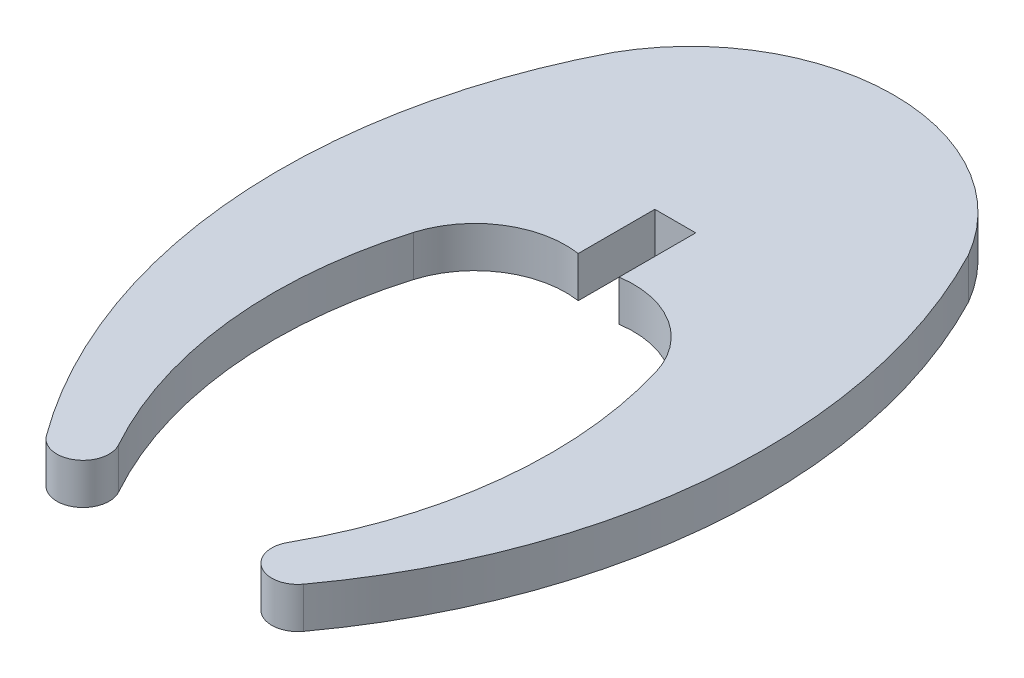
ISO-10303-21;
HEADER;
FILE_DESCRIPTION(('STEP AP214'),'2;1');
FILE_NAME('part.step','',(''),(''),'','','');
FILE_SCHEMA(('AUTOMOTIVE_DESIGN { 1 0 10303 214 1 1 1 1 }'));
ENDSEC;
DATA;
#1=APPLICATION_CONTEXT('core data for automotive mechanical design processes');
#2=APPLICATION_PROTOCOL_DEFINITION('international standard','automotive_design',2000,#1);
#3=PRODUCT_CONTEXT('',#1,'mechanical');
#4=PRODUCT('Part','Part','',(#3));
#5=PRODUCT_RELATED_PRODUCT_CATEGORY('part','',(#4));
#6=PRODUCT_DEFINITION_FORMATION('','',#4);
#7=PRODUCT_DEFINITION_CONTEXT('part definition',#1,'design');
#8=PRODUCT_DEFINITION('design','',#6,#7);
#9=PRODUCT_DEFINITION_SHAPE('','',#8);
#10=(LENGTH_UNIT() NAMED_UNIT(*) SI_UNIT(.MILLI.,.METRE.));
#11=(NAMED_UNIT(*) PLANE_ANGLE_UNIT() SI_UNIT($,.RADIAN.));
#12=(NAMED_UNIT(*) SI_UNIT($,.STERADIAN.) SOLID_ANGLE_UNIT());
#13=UNCERTAINTY_MEASURE_WITH_UNIT(LENGTH_MEASURE(1.E-05),#10,'distance_accuracy_value','');
#14=(GEOMETRIC_REPRESENTATION_CONTEXT(3) GLOBAL_UNCERTAINTY_ASSIGNED_CONTEXT((#13)) GLOBAL_UNIT_ASSIGNED_CONTEXT((#10,
#11,#12)) REPRESENTATION_CONTEXT('',''));
#15=CARTESIAN_POINT('',(0.,0.,0.));
#16=DIRECTION('',(0.,0.,1.));
#17=DIRECTION('',(1.,0.,0.));
#18=AXIS2_PLACEMENT_3D('',#15,#16,#17);
#19=CARTESIAN_POINT('',(-42020.7050947911,3.,-18314.3835108884));
#20=DIRECTION('',(0.,-1.,0.));
#21=DIRECTION('',(0.,0.,-1.));
#22=AXIS2_PLACEMENT_3D('',#19,#20,#21);
#23=CYLINDRICAL_SURFACE('',#22,6.67415036290321);
#24=CARTESIAN_POINT('',(-42020.7050947911,0.,-18314.3835108884));
#25=DIRECTION('',(0.,-1.,0.));
#26=DIRECTION('',(0.,0.,1.));
#27=AXIS2_PLACEMENT_3D('',#24,#25,#26);
#28=CIRCLE('',#27,6.67415036290321);
#29=CARTESIAN_POINT('',(-42027.104185,0.,-18316.279804));
#30=VERTEX_POINT('',#29);
#31=CARTESIAN_POINT('',(-42019.71875,0.,-18320.984375));
#32=VERTEX_POINT('',#31);
#33=EDGE_CURVE('E155',#30,#32,#28,.T.);
#34=ORIENTED_EDGE('',*,*,#33,.T.);
#35=DIRECTION('',(0.,-1.,0.));
#36=VECTOR('',#35,1.);
#37=CARTESIAN_POINT('',(-42019.71875,3.,-18320.984375));
#38=LINE('',#37,#36);
#39=CARTESIAN_POINT('',(-42019.71875,3.,-18320.984375));
#40=VERTEX_POINT('',#39);
#41=EDGE_CURVE('E11',#40,#32,#38,.T.);
#42=ORIENTED_EDGE('',*,*,#41,.F.);
#43=CARTESIAN_POINT('',(-42020.7050947911,3.,-18314.3835108884));
#44=DIRECTION('',(0.,-1.,0.));
#45=DIRECTION('',(0.,0.,1.));
#46=AXIS2_PLACEMENT_3D('',#43,#44,#45);
#47=CIRCLE('',#46,6.67415036290321);
#48=CARTESIAN_POINT('',(-42027.104185,3.,-18316.279804));
#49=VERTEX_POINT('',#48);
#50=EDGE_CURVE('E177',#49,#40,#47,.T.);
#51=ORIENTED_EDGE('',*,*,#50,.F.);
#52=DIRECTION('',(0.,-1.,0.));
#53=VECTOR('',#52,1.);
#54=CARTESIAN_POINT('',(-42027.104185,3.,-18316.279804));
#55=LINE('',#54,#53);
#56=EDGE_CURVE('E151',#49,#30,#55,.T.);
#57=ORIENTED_EDGE('',*,*,#56,.T.);
#58=EDGE_LOOP('',(#34,#42,#51,#57));
#59=FACE_BOUND('',#58,.T.);
#60=ADVANCED_FACE('F35',(#59),#23,.F.);
#61=CARTESIAN_POINT('',(-42019.71875,3.,-18320.984375));
#62=DIRECTION('',(-1.,0.,0.));
#63=DIRECTION('',(0.,0.,1.));
#64=AXIS2_PLACEMENT_3D('',#61,#62,#63);
#65=PLANE('',#64);
#66=DIRECTION('',(0.,0.,-1.));
#67=VECTOR('',#66,1.);
#68=CARTESIAN_POINT('',(-42019.71875,0.,-18320.984375));
#69=LINE('',#68,#67);
#70=CARTESIAN_POINT('',(-42019.71875,0.,-18326.601562));
#71=VERTEX_POINT('',#70);
#72=EDGE_CURVE('E158',#32,#71,#69,.T.);
#73=ORIENTED_EDGE('',*,*,#72,.T.);
#74=DIRECTION('',(0.,-1.,0.));
#75=VECTOR('',#74,1.);
#76=CARTESIAN_POINT('',(-42019.71875,3.,-18326.601562));
#77=LINE('',#76,#75);
#78=CARTESIAN_POINT('',(-42019.71875,3.,-18326.601562));
#79=VERTEX_POINT('',#78);
#80=EDGE_CURVE('E43',#79,#71,#77,.T.);
#81=ORIENTED_EDGE('',*,*,#80,.F.);
#82=DIRECTION('',(0.,0.,-1.));
#83=VECTOR('',#82,1.);
#84=CARTESIAN_POINT('',(-42019.71875,3.,-18320.984375));
#85=LINE('',#84,#83);
#86=EDGE_CURVE('E106',#40,#79,#85,.T.);
#87=ORIENTED_EDGE('',*,*,#86,.F.);
#88=ORIENTED_EDGE('',*,*,#41,.T.);
#89=EDGE_LOOP('',(#73,#81,#87,#88));
#90=FACE_BOUND('',#89,.T.);
#91=ADVANCED_FACE('F255',(#90),#65,.F.);
#92=CARTESIAN_POINT('',(-42019.71875,3.,-18326.601562));
#93=DIRECTION('',(0.,0.,-1.));
#94=DIRECTION('',(-1.,0.,0.));
#95=AXIS2_PLACEMENT_3D('',#92,#93,#94);
#96=PLANE('',#95);
#97=DIRECTION('',(1.,0.,0.));
#98=VECTOR('',#97,1.);
#99=CARTESIAN_POINT('',(-42019.71875,0.,-18326.601562));
#100=LINE('',#99,#98);
#101=CARTESIAN_POINT('',(-42016.722656,0.,-18326.601562));
#102=VERTEX_POINT('',#101);
#103=EDGE_CURVE('E160',#71,#102,#100,.T.);
#104=ORIENTED_EDGE('',*,*,#103,.T.);
#105=DIRECTION('',(0.,-1.,0.));
#106=VECTOR('',#105,1.);
#107=CARTESIAN_POINT('',(-42016.722656,3.,-18326.601562));
#108=LINE('',#107,#106);
#109=CARTESIAN_POINT('',(-42016.722656,3.,-18326.601562));
#110=VERTEX_POINT('',#109);
#111=EDGE_CURVE('E196',#110,#102,#108,.T.);
#112=ORIENTED_EDGE('',*,*,#111,.F.);
#113=DIRECTION('',(1.,0.,0.));
#114=VECTOR('',#113,1.);
#115=CARTESIAN_POINT('',(-42019.71875,3.,-18326.601562));
#116=LINE('',#115,#114);
#117=EDGE_CURVE('E204',#79,#110,#116,.T.);
#118=ORIENTED_EDGE('',*,*,#117,.F.);
#119=ORIENTED_EDGE('',*,*,#80,.T.);
#120=EDGE_LOOP('',(#104,#112,#118,#119));
#121=FACE_BOUND('',#120,.T.);
#122=ADVANCED_FACE('F202',(#121),#96,.F.);
#123=CARTESIAN_POINT('',(-42016.722656,3.,-18326.601562));
#124=DIRECTION('',(1.,0.,-6.32692008702308E-12));
#125=DIRECTION('',(-6.32692008702308E-12,0.,-1.));
#126=AXIS2_PLACEMENT_3D('',#123,#124,#125);
#127=PLANE('',#126);
#128=DIRECTION('',(6.32692008702308E-12,0.,1.));
#129=VECTOR('',#128,1.);
#130=CARTESIAN_POINT('',(-42016.722656,0.,-18326.601562));
#131=LINE('',#130,#129);
#132=CARTESIAN_POINT('',(-42016.722656,0.,-18320.986328));
#133=VERTEX_POINT('',#132);
#134=EDGE_CURVE('E162',#102,#133,#131,.T.);
#135=ORIENTED_EDGE('',*,*,#134,.T.);
#136=DIRECTION('',(0.,-1.,0.));
#137=VECTOR('',#136,1.);
#138=CARTESIAN_POINT('',(-42016.722656,3.,-18320.986328));
#139=LINE('',#138,#137);
#140=CARTESIAN_POINT('',(-42016.722656,3.,-18320.986328));
#141=VERTEX_POINT('',#140);
#142=EDGE_CURVE('E193',#141,#133,#139,.T.);
#143=ORIENTED_EDGE('',*,*,#142,.F.);
#144=DIRECTION('',(6.32692008702308E-12,0.,1.));
#145=VECTOR('',#144,1.);
#146=CARTESIAN_POINT('',(-42016.722656,3.,-18326.601562));
#147=LINE('',#146,#145);
#148=EDGE_CURVE('E222',#110,#141,#147,.T.);
#149=ORIENTED_EDGE('',*,*,#148,.F.);
#150=ORIENTED_EDGE('',*,*,#111,.T.);
#151=EDGE_LOOP('',(#135,#143,#149,#150));
#152=FACE_BOUND('',#151,.T.);
#153=ADVANCED_FACE('F213',(#152),#127,.F.);
#154=CARTESIAN_POINT('',(-42015.7380765068,3.,-18314.3865887005));
#155=DIRECTION('',(0.,-1.,0.));
#156=DIRECTION('',(0.,0.,-1.));
#157=AXIS2_PLACEMENT_3D('',#154,#155,#156);
#158=CYLINDRICAL_SURFACE('',#157,6.67277720290093);
#159=CARTESIAN_POINT('',(-42015.7380765068,0.,-18314.3865887005));
#160=DIRECTION('',(0.,-1.,0.));
#161=DIRECTION('',(0.,0.,1.));
#162=AXIS2_PLACEMENT_3D('',#159,#160,#161);
#163=CIRCLE('',#162,6.67277720290093);
#164=CARTESIAN_POINT('',(-42009.340276,0.,-18316.282401));
#165=VERTEX_POINT('',#164);
#166=EDGE_CURVE('E164',#133,#165,#163,.T.);
#167=ORIENTED_EDGE('',*,*,#166,.T.);
#168=DIRECTION('',(0.,-1.,0.));
#169=VECTOR('',#168,1.);
#170=CARTESIAN_POINT('',(-42009.340276,3.,-18316.282401));
#171=LINE('',#170,#169);
#172=CARTESIAN_POINT('',(-42009.340276,3.,-18316.282401));
#173=VERTEX_POINT('',#172);
#174=EDGE_CURVE('E190',#173,#165,#171,.T.);
#175=ORIENTED_EDGE('',*,*,#174,.F.);
#176=CARTESIAN_POINT('',(-42015.7380765068,3.,-18314.3865887005));
#177=DIRECTION('',(0.,-1.,0.));
#178=DIRECTION('',(0.,0.,1.));
#179=AXIS2_PLACEMENT_3D('',#176,#177,#178);
#180=CIRCLE('',#179,6.67277720290093);
#181=EDGE_CURVE('E219',#141,#173,#180,.T.);
#182=ORIENTED_EDGE('',*,*,#181,.F.);
#183=ORIENTED_EDGE('',*,*,#142,.T.);
#184=EDGE_LOOP('',(#167,#175,#182,#183));
#185=FACE_BOUND('',#184,.T.);
#186=ADVANCED_FACE('F217',(#185),#158,.F.);
#187=CARTESIAN_POINT('',(-42039.5901535017,3.,-18307.3175005346));
#188=DIRECTION('',(0.,-1.,0.));
#189=DIRECTION('',(0.,0.,-1.));
#190=AXIS2_PLACEMENT_3D('',#187,#188,#189);
#191=CYLINDRICAL_SURFACE('',#190,31.5503491141021);
#192=CARTESIAN_POINT('',(-42039.5901535017,0.,-18307.3175005346));
#193=DIRECTION('',(0.,-1.,0.));
#194=DIRECTION('',(0.,0.,1.));
#195=AXIS2_PLACEMENT_3D('',#192,#193,#194);
#196=CIRCLE('',#195,31.5503491141021);
#197=CARTESIAN_POINT('',(-42012.014861,0.,-18291.9868850001));
#198=VERTEX_POINT('',#197);
#199=EDGE_CURVE('E166',#165,#198,#196,.T.);
#200=ORIENTED_EDGE('',*,*,#199,.T.);
#201=DIRECTION('',(0.,-1.,0.));
#202=VECTOR('',#201,1.);
#203=CARTESIAN_POINT('',(-42012.014861,3.,-18291.9868850001));
#204=LINE('',#203,#202);
#205=CARTESIAN_POINT('',(-42012.014861,3.,-18291.9868850001));
#206=VERTEX_POINT('',#205);
#207=EDGE_CURVE('E187',#206,#198,#204,.T.);
#208=ORIENTED_EDGE('',*,*,#207,.F.);
#209=CARTESIAN_POINT('',(-42039.5901535017,3.,-18307.3175005346));
#210=DIRECTION('',(0.,-1.,0.));
#211=DIRECTION('',(0.,0.,1.));
#212=AXIS2_PLACEMENT_3D('',#209,#210,#211);
#213=CIRCLE('',#212,31.5503491141021);
#214=EDGE_CURVE('E221',#173,#206,#213,.T.);
#215=ORIENTED_EDGE('',*,*,#214,.F.);
#216=ORIENTED_EDGE('',*,*,#174,.T.);
#217=EDGE_LOOP('',(#200,#208,#215,#216));
#218=FACE_BOUND('',#217,.T.);
#219=ADVANCED_FACE('F268',(#218),#191,.F.);
#220=CARTESIAN_POINT('',(-42010.3400105149,3.,-18291.050888032));
#221=DIRECTION('',(0.,-1.,0.));
#222=DIRECTION('',(0.,0.,-1.));
#223=AXIS2_PLACEMENT_3D('',#220,#221,#222);
#224=CYLINDRICAL_SURFACE('',#223,1.91864912680044);
#225=CARTESIAN_POINT('',(-42010.3400105149,0.,-18291.050888032));
#226=DIRECTION('',(0.,1.,0.));
#227=DIRECTION('',(0.,0.,1.));
#228=AXIS2_PLACEMENT_3D('',#225,#226,#227);
#229=CIRCLE('',#228,1.91864912680044);
#230=CARTESIAN_POINT('',(-42008.793025,0.,-18289.915965));
#231=VERTEX_POINT('',#230);
#232=EDGE_CURVE('E168',#198,#231,#229,.T.);
#233=ORIENTED_EDGE('',*,*,#232,.T.);
#234=DIRECTION('',(0.,-1.,0.));
#235=VECTOR('',#234,1.);
#236=CARTESIAN_POINT('',(-42008.793025,3.,-18289.915965));
#237=LINE('',#236,#235);
#238=CARTESIAN_POINT('',(-42008.793025,3.,-18289.915965));
#239=VERTEX_POINT('',#238);
#240=EDGE_CURVE('E184',#239,#231,#237,.T.);
#241=ORIENTED_EDGE('',*,*,#240,.F.);
#242=CARTESIAN_POINT('',(-42010.3400105149,3.,-18291.050888032));
#243=DIRECTION('',(0.,1.,0.));
#244=DIRECTION('',(0.,0.,1.));
#245=AXIS2_PLACEMENT_3D('',#242,#243,#244);
#246=CIRCLE('',#245,1.91864912680044);
#247=EDGE_CURVE('E224',#206,#239,#246,.T.);
#248=ORIENTED_EDGE('',*,*,#247,.F.);
#249=ORIENTED_EDGE('',*,*,#207,.T.);
#250=EDGE_LOOP('',(#233,#241,#248,#249));
#251=FACE_BOUND('',#250,.T.);
#252=ADVANCED_FACE('F271',(#251),#224,.T.);
#253=CARTESIAN_POINT('',(-42043.4335365749,3.,-18315.3464519694));
#254=DIRECTION('',(0.,-1.,0.));
#255=DIRECTION('',(0.,0.,-1.));
#256=AXIS2_PLACEMENT_3D('',#253,#254,#255);
#257=CYLINDRICAL_SURFACE('',#256,42.9729532342011);
#258=CARTESIAN_POINT('',(-42043.4335365749,0.,-18315.3464519694));
#259=DIRECTION('',(0.,1.,0.));
#260=DIRECTION('',(0.,0.,1.));
#261=AXIS2_PLACEMENT_3D('',#258,#259,#260);
#262=CIRCLE('',#261,42.9729532342011);
#263=CARTESIAN_POINT('',(-42005.321092,0.,-18335.198814));
#264=VERTEX_POINT('',#263);
#265=EDGE_CURVE('E170',#231,#264,#262,.T.);
#266=ORIENTED_EDGE('',*,*,#265,.T.);
#267=DIRECTION('',(0.,-1.,0.));
#268=VECTOR('',#267,1.);
#269=CARTESIAN_POINT('',(-42005.321092,3.,-18335.198814));
#270=LINE('',#269,#268);
#271=CARTESIAN_POINT('',(-42005.321092,3.,-18335.198814));
#272=VERTEX_POINT('',#271);
#273=EDGE_CURVE('E181',#272,#264,#270,.T.);
#274=ORIENTED_EDGE('',*,*,#273,.F.);
#275=CARTESIAN_POINT('',(-42043.4335365749,3.,-18315.3464519694));
#276=DIRECTION('',(0.,1.,0.));
#277=DIRECTION('',(0.,0.,1.));
#278=AXIS2_PLACEMENT_3D('',#275,#276,#277);
#279=CIRCLE('',#278,42.9729532342011);
#280=EDGE_CURVE('E230',#239,#272,#279,.T.);
#281=ORIENTED_EDGE('',*,*,#280,.F.);
#282=ORIENTED_EDGE('',*,*,#240,.T.);
#283=EDGE_LOOP('',(#266,#274,#281,#282));
#284=FACE_BOUND('',#283,.T.);
#285=ADVANCED_FACE('F236',(#284),#257,.T.);
#286=CARTESIAN_POINT('',(-42018.2174311932,3.,-18327.7070382815));
#287=DIRECTION('',(0.,-1.,0.));
#288=DIRECTION('',(0.,0.,-1.));
#289=AXIS2_PLACEMENT_3D('',#286,#287,#288);
#290=CYLINDRICAL_SURFACE('',#289,14.9144985836977);
#291=CARTESIAN_POINT('',(-42018.2174311932,0.,-18327.7070382815));
#292=DIRECTION('',(0.,1.,0.));
#293=DIRECTION('',(0.,0.,1.));
#294=AXIS2_PLACEMENT_3D('',#291,#292,#293);
#295=CIRCLE('',#294,14.9144985836977);
#296=CARTESIAN_POINT('',(-42031.1956930001,0.,-18335.055983));
#297=VERTEX_POINT('',#296);
#298=EDGE_CURVE('E172',#264,#297,#295,.T.);
#299=ORIENTED_EDGE('',*,*,#298,.T.);
#300=DIRECTION('',(0.,-1.,0.));
#301=VECTOR('',#300,1.);
#302=CARTESIAN_POINT('',(-42031.1956930001,3.,-18335.055983));
#303=LINE('',#302,#301);
#304=CARTESIAN_POINT('',(-42031.1956930001,3.,-18335.055983));
#305=VERTEX_POINT('',#304);
#306=EDGE_CURVE('E146',#305,#297,#303,.T.);
#307=ORIENTED_EDGE('',*,*,#306,.F.);
#308=CARTESIAN_POINT('',(-42018.2174311932,3.,-18327.7070382815));
#309=DIRECTION('',(0.,1.,0.));
#310=DIRECTION('',(0.,0.,1.));
#311=AXIS2_PLACEMENT_3D('',#308,#309,#310);
#312=CIRCLE('',#311,14.9144985836977);
#313=EDGE_CURVE('E137',#272,#305,#312,.T.);
#314=ORIENTED_EDGE('',*,*,#313,.F.);
#315=ORIENTED_EDGE('',*,*,#273,.T.);
#316=EDGE_LOOP('',(#299,#307,#314,#315));
#317=FACE_BOUND('',#316,.T.);
#318=ADVANCED_FACE('F240',(#317),#290,.T.);
#319=CARTESIAN_POINT('',(-41993.0077657636,3.,-18315.3490206409));
#320=DIRECTION('',(0.,-1.,0.));
#321=DIRECTION('',(0.,0.,-1.));
#322=AXIS2_PLACEMENT_3D('',#319,#320,#321);
#323=CYLINDRICAL_SURFACE('',#322,42.9730398278037);
#324=CARTESIAN_POINT('',(-41993.0077657636,0.,-18315.3490206409));
#325=DIRECTION('',(0.,1.,0.));
#326=DIRECTION('',(0.,0.,1.));
#327=AXIS2_PLACEMENT_3D('',#324,#325,#326);
#328=CIRCLE('',#327,42.9730398278037);
#329=CARTESIAN_POINT('',(-42027.6485700001,0.,-18289.918786));
#330=VERTEX_POINT('',#329);
#331=EDGE_CURVE('E145',#297,#330,#328,.T.);
#332=ORIENTED_EDGE('',*,*,#331,.T.);
#333=DIRECTION('',(0.,-1.,0.));
#334=VECTOR('',#333,1.);
#335=CARTESIAN_POINT('',(-42027.6485700001,3.,-18289.918786));
#336=LINE('',#335,#334);
#337=CARTESIAN_POINT('',(-42027.6485700001,3.,-18289.918786));
#338=VERTEX_POINT('',#337);
#339=EDGE_CURVE('E142',#338,#330,#336,.T.);
#340=ORIENTED_EDGE('',*,*,#339,.F.);
#341=CARTESIAN_POINT('',(-41993.0077657636,3.,-18315.3490206409));
#342=DIRECTION('',(0.,1.,0.));
#343=DIRECTION('',(0.,0.,1.));
#344=AXIS2_PLACEMENT_3D('',#341,#342,#343);
#345=CIRCLE('',#344,42.9730398278037);
#346=EDGE_CURVE('E131',#305,#338,#345,.T.);
#347=ORIENTED_EDGE('',*,*,#346,.F.);
#348=ORIENTED_EDGE('',*,*,#306,.T.);
#349=EDGE_LOOP('',(#332,#340,#347,#348));
#350=FACE_BOUND('',#349,.T.);
#351=ADVANCED_FACE('F143',(#350),#323,.T.);
#352=CARTESIAN_POINT('',(-42026.0988334865,3.,-18291.0519798758));
#353=DIRECTION('',(0.,-1.,0.));
#354=DIRECTION('',(0.,0.,-1.));
#355=AXIS2_PLACEMENT_3D('',#352,#353,#354);
#356=CYLINDRICAL_SURFACE('',#355,1.91984677040394);
#357=CARTESIAN_POINT('',(-42026.0988334865,0.,-18291.0519798758));
#358=DIRECTION('',(0.,1.,0.));
#359=DIRECTION('',(0.,0.,1.));
#360=AXIS2_PLACEMENT_3D('',#357,#358,#359);
#361=CIRCLE('',#360,1.91984677040394);
#362=CARTESIAN_POINT('',(-42024.421329,0.,-18291.985677));
#363=VERTEX_POINT('',#362);
#364=EDGE_CURVE('E92',#330,#363,#361,.T.);
#365=ORIENTED_EDGE('',*,*,#364,.T.);
#366=DIRECTION('',(0.,-1.,0.));
#367=VECTOR('',#366,1.);
#368=CARTESIAN_POINT('',(-42024.421329,3.,-18291.985677));
#369=LINE('',#368,#367);
#370=CARTESIAN_POINT('',(-42024.421329,3.,-18291.985677));
#371=VERTEX_POINT('',#370);
#372=EDGE_CURVE('E147',#371,#363,#369,.T.);
#373=ORIENTED_EDGE('',*,*,#372,.F.);
#374=CARTESIAN_POINT('',(-42026.0988334865,3.,-18291.0519798758));
#375=DIRECTION('',(0.,1.,0.));
#376=DIRECTION('',(0.,0.,1.));
#377=AXIS2_PLACEMENT_3D('',#374,#375,#376);
#378=CIRCLE('',#377,1.91984677040394);
#379=EDGE_CURVE('E135',#338,#371,#378,.T.);
#380=ORIENTED_EDGE('',*,*,#379,.F.);
#381=ORIENTED_EDGE('',*,*,#339,.T.);
#382=EDGE_LOOP('',(#365,#373,#380,#381));
#383=FACE_BOUND('',#382,.T.);
#384=ADVANCED_FACE('F149',(#383),#356,.T.);
#385=CARTESIAN_POINT('',(-41996.8521247334,3.,-18307.3254077335));
#386=DIRECTION('',(0.,-1.,0.));
#387=DIRECTION('',(0.,0.,-1.));
#388=AXIS2_PLACEMENT_3D('',#385,#386,#387);
#389=CYLINDRICAL_SURFACE('',#388,31.5494589948884);
#390=CARTESIAN_POINT('',(-41996.8521247334,0.,-18307.3254077335));
#391=DIRECTION('',(0.,-1.,0.));
#392=DIRECTION('',(0.,0.,1.));
#393=AXIS2_PLACEMENT_3D('',#390,#391,#392);
#394=CIRCLE('',#393,31.5494589948884);
#395=EDGE_CURVE('E98',#363,#30,#394,.T.);
#396=ORIENTED_EDGE('',*,*,#395,.T.);
#397=ORIENTED_EDGE('',*,*,#56,.F.);
#398=CARTESIAN_POINT('',(-41996.8521247334,3.,-18307.3254077335));
#399=DIRECTION('',(0.,-1.,0.));
#400=DIRECTION('',(0.,0.,1.));
#401=AXIS2_PLACEMENT_3D('',#398,#399,#400);
#402=CIRCLE('',#401,31.5494589948884);
#403=EDGE_CURVE('E51',#371,#49,#402,.T.);
#404=ORIENTED_EDGE('',*,*,#403,.F.);
#405=ORIENTED_EDGE('',*,*,#372,.T.);
#406=EDGE_LOOP('',(#396,#397,#404,#405));
#407=FACE_BOUND('',#406,.T.);
#408=ADVANCED_FACE('F244',(#407),#389,.F.);
#409=CARTESIAN_POINT('',(-42020.7050947911,3.,-18314.3835108884));
#410=DIRECTION('',(0.,1.,0.));
#411=DIRECTION('',(0.,0.,1.));
#412=AXIS2_PLACEMENT_3D('',#409,#410,#411);
#413=PLANE('',#412);
#414=ORIENTED_EDGE('',*,*,#50,.T.);
#415=ORIENTED_EDGE('',*,*,#86,.T.);
#416=ORIENTED_EDGE('',*,*,#117,.T.);
#417=ORIENTED_EDGE('',*,*,#148,.T.);
#418=ORIENTED_EDGE('',*,*,#181,.T.);
#419=ORIENTED_EDGE('',*,*,#214,.T.);
#420=ORIENTED_EDGE('',*,*,#247,.T.);
#421=ORIENTED_EDGE('',*,*,#280,.T.);
#422=ORIENTED_EDGE('',*,*,#313,.T.);
#423=ORIENTED_EDGE('',*,*,#346,.T.);
#424=ORIENTED_EDGE('',*,*,#379,.T.);
#425=ORIENTED_EDGE('',*,*,#403,.T.);
#426=EDGE_LOOP('',(#414,#415,#416,#417,#418,#419,#420,#421,#422,#423,#424,#425));
#427=FACE_BOUND('',#426,.T.);
#428=ADVANCED_FACE('F133',(#427),#413,.T.);
#429=CARTESIAN_POINT('',(-42020.7050947911,0.,-18314.3835108884));
#430=DIRECTION('',(0.,1.,0.));
#431=DIRECTION('',(0.,0.,1.));
#432=AXIS2_PLACEMENT_3D('',#429,#430,#431);
#433=PLANE('',#432);
#434=ORIENTED_EDGE('',*,*,#33,.F.);
#435=ORIENTED_EDGE('',*,*,#395,.F.);
#436=ORIENTED_EDGE('',*,*,#364,.F.);
#437=ORIENTED_EDGE('',*,*,#331,.F.);
#438=ORIENTED_EDGE('',*,*,#298,.F.);
#439=ORIENTED_EDGE('',*,*,#265,.F.);
#440=ORIENTED_EDGE('',*,*,#232,.F.);
#441=ORIENTED_EDGE('',*,*,#199,.F.);
#442=ORIENTED_EDGE('',*,*,#166,.F.);
#443=ORIENTED_EDGE('',*,*,#134,.F.);
#444=ORIENTED_EDGE('',*,*,#103,.F.);
#445=ORIENTED_EDGE('',*,*,#72,.F.);
#446=EDGE_LOOP('',(#434,#435,#436,#437,#438,#439,#440,#441,#442,#443,#444,#445));
#447=FACE_BOUND('',#446,.T.);
#448=ADVANCED_FACE('F208',(#447),#433,.F.);
#449=CLOSED_SHELL('',(#60,#91,#122,#153,#186,#219,#252,#285,#318,#351,#384,#408,#428,#448));
#450=MANIFOLD_SOLID_BREP('B2',#449);
#451=ADVANCED_BREP_SHAPE_REPRESENTATION('',(#18,#450),#14);
#452=SHAPE_DEFINITION_REPRESENTATION(#9,#451);
ENDSEC;
END-ISO-10303-21;
